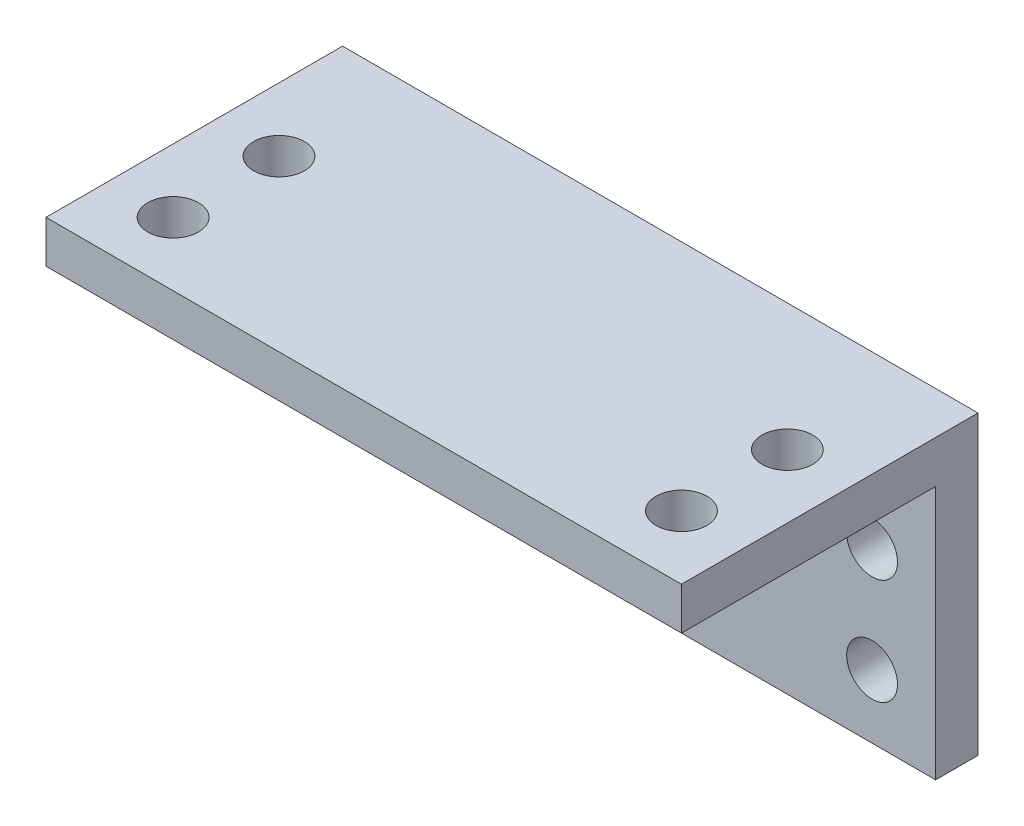
ISO-10303-21;
HEADER;
FILE_DESCRIPTION(('STEP AP214'),'2;1');
FILE_NAME('part.step','',(''),(''),'','','');
FILE_SCHEMA(('AUTOMOTIVE_DESIGN { 1 0 10303 214 1 1 1 1 }'));
ENDSEC;
DATA;
#1=APPLICATION_CONTEXT('core data for automotive mechanical design processes');
#2=APPLICATION_PROTOCOL_DEFINITION('international standard','automotive_design',2000,#1);
#3=PRODUCT_CONTEXT('',#1,'mechanical');
#4=PRODUCT('Part','Part','',(#3));
#5=PRODUCT_RELATED_PRODUCT_CATEGORY('part','',(#4));
#6=PRODUCT_DEFINITION_FORMATION('','',#4);
#7=PRODUCT_DEFINITION_CONTEXT('part definition',#1,'design');
#8=PRODUCT_DEFINITION('design','',#6,#7);
#9=PRODUCT_DEFINITION_SHAPE('','',#8);
#10=(LENGTH_UNIT() NAMED_UNIT(*) SI_UNIT(.MILLI.,.METRE.));
#11=(NAMED_UNIT(*) PLANE_ANGLE_UNIT() SI_UNIT($,.RADIAN.));
#12=(NAMED_UNIT(*) SI_UNIT($,.STERADIAN.) SOLID_ANGLE_UNIT());
#13=UNCERTAINTY_MEASURE_WITH_UNIT(LENGTH_MEASURE(1.E-05),#10,'distance_accuracy_value','');
#14=(GEOMETRIC_REPRESENTATION_CONTEXT(3) GLOBAL_UNCERTAINTY_ASSIGNED_CONTEXT((#13)) GLOBAL_UNIT_ASSIGNED_CONTEXT((#10,
#11,#12)) REPRESENTATION_CONTEXT('',''));
#15=CARTESIAN_POINT('',(0.,0.,0.));
#16=DIRECTION('',(0.,0.,1.));
#17=DIRECTION('',(1.,0.,0.));
#18=AXIS2_PLACEMENT_3D('',#15,#16,#17);
#19=CARTESIAN_POINT('',(38.1,-21.9756544502618,2.18094240837696));
#20=DIRECTION('',(0.,0.,-1.));
#21=DIRECTION('',(-1.,0.,0.));
#22=AXIS2_PLACEMENT_3D('',#19,#20,#21);
#23=PLANE('',#22);
#24=DIRECTION('',(0.,-1.,0.));
#25=VECTOR('',#24,1.);
#26=CARTESIAN_POINT('',(0.,-21.9756544502618,2.18094240837696));
#27=LINE('',#26,#25);
#28=CARTESIAN_POINT('',(0.,-19.4356544502618,2.18094240837696));
#29=VERTEX_POINT('',#28);
#30=CARTESIAN_POINT('',(0.,-21.9756544502618,2.18094240837696));
#31=VERTEX_POINT('',#30);
#32=EDGE_CURVE('E132',#29,#31,#27,.T.);
#33=ORIENTED_EDGE('',*,*,#32,.T.);
#34=DIRECTION('',(-1.,0.,0.));
#35=VECTOR('',#34,1.);
#36=CARTESIAN_POINT('',(38.1,-21.9756544502618,2.18094240837696));
#37=LINE('',#36,#35);
#38=CARTESIAN_POINT('',(38.1,-21.9756544502618,2.18094240837696));
#39=VERTEX_POINT('',#38);
#40=EDGE_CURVE('E11',#39,#31,#37,.T.);
#41=ORIENTED_EDGE('',*,*,#40,.F.);
#42=DIRECTION('',(0.,-1.,0.));
#43=VECTOR('',#42,1.);
#44=CARTESIAN_POINT('',(38.1,-21.9756544502618,2.18094240837696));
#45=LINE('',#44,#43);
#46=CARTESIAN_POINT('',(38.1,-19.4356544502618,2.18094240837696));
#47=VERTEX_POINT('',#46);
#48=EDGE_CURVE('E149',#47,#39,#45,.T.);
#49=ORIENTED_EDGE('',*,*,#48,.F.);
#50=DIRECTION('',(-1.,0.,0.));
#51=VECTOR('',#50,1.);
#52=CARTESIAN_POINT('',(38.1,-19.4356544502618,2.18094240837696));
#53=LINE('',#52,#51);
#54=EDGE_CURVE('E128',#47,#29,#53,.T.);
#55=ORIENTED_EDGE('',*,*,#54,.T.);
#56=EDGE_LOOP('',(#33,#41,#49,#55));
#57=FACE_BOUND('',#56,.T.);
#58=ADVANCED_FACE('F43',(#57),#23,.F.);
#59=CARTESIAN_POINT('',(38.1,-21.9756544502618,-13.059057591623));
#60=DIRECTION('',(0.,1.,0.));
#61=DIRECTION('',(0.,0.,1.));
#62=AXIS2_PLACEMENT_3D('',#59,#60,#61);
#63=PLANE('',#62);
#64=CARTESIAN_POINT('',(34.29,-21.9756544502618,-1.62905759162304));
#65=DIRECTION('',(0.,1.,0.));
#66=DIRECTION('',(0.,0.,1.));
#67=AXIS2_PLACEMENT_3D('',#64,#65,#66);
#68=CIRCLE('',#67,1.524);
#69=CARTESIAN_POINT('',(34.29,-21.9756544502618,-0.105057591623037));
#70=VERTEX_POINT('',#69);
#71=EDGE_CURVE('E354',#70,#70,#68,.T.);
#72=ORIENTED_EDGE('',*,*,#71,.T.);
#73=EDGE_LOOP('',(#72));
#74=FACE_BOUND('',#73,.T.);
#75=CARTESIAN_POINT('',(3.80999999999998,-21.9756544502618,-7.97905759162304));
#76=DIRECTION('',(0.,1.,0.));
#77=DIRECTION('',(0.,0.,1.));
#78=AXIS2_PLACEMENT_3D('',#75,#76,#77);
#79=CIRCLE('',#78,1.524);
#80=CARTESIAN_POINT('',(3.80999999999998,-21.9756544502618,-6.45505759162303));
#81=VERTEX_POINT('',#80);
#82=EDGE_CURVE('E357',#81,#81,#79,.T.);
#83=ORIENTED_EDGE('',*,*,#82,.T.);
#84=EDGE_LOOP('',(#83));
#85=FACE_BOUND('',#84,.T.);
#86=CARTESIAN_POINT('',(34.29,-21.9756544502618,-7.97905759162304));
#87=DIRECTION('',(0.,1.,0.));
#88=DIRECTION('',(0.,0.,1.));
#89=AXIS2_PLACEMENT_3D('',#86,#87,#88);
#90=CIRCLE('',#89,1.524);
#91=CARTESIAN_POINT('',(34.29,-21.9756544502618,-6.45505759162304));
#92=VERTEX_POINT('',#91);
#93=EDGE_CURVE('E365',#92,#92,#90,.T.);
#94=ORIENTED_EDGE('',*,*,#93,.T.);
#95=EDGE_LOOP('',(#94));
#96=FACE_BOUND('',#95,.T.);
#97=CARTESIAN_POINT('',(3.81,-21.9756544502618,-1.62905759162304));
#98=DIRECTION('',(0.,1.,0.));
#99=DIRECTION('',(0.,0.,1.));
#100=AXIS2_PLACEMENT_3D('',#97,#98,#99);
#101=CIRCLE('',#100,1.524);
#102=CARTESIAN_POINT('',(3.81,-21.9756544502618,-0.105057591623035));
#103=VERTEX_POINT('',#102);
#104=EDGE_CURVE('E420',#103,#103,#101,.T.);
#105=ORIENTED_EDGE('',*,*,#104,.T.);
#106=EDGE_LOOP('',(#105));
#107=FACE_BOUND('',#106,.T.);
#108=DIRECTION('',(0.,0.,-1.));
#109=VECTOR('',#108,1.);
#110=CARTESIAN_POINT('',(0.,-21.9756544502618,-13.059057591623));
#111=LINE('',#110,#109);
#112=CARTESIAN_POINT('',(0.,-21.9756544502618,-13.059057591623));
#113=VERTEX_POINT('',#112);
#114=EDGE_CURVE('E136',#31,#113,#111,.T.);
#115=ORIENTED_EDGE('',*,*,#114,.T.);
#116=DIRECTION('',(-1.,0.,0.));
#117=VECTOR('',#116,1.);
#118=CARTESIAN_POINT('',(38.1,-21.9756544502618,-13.059057591623));
#119=LINE('',#118,#117);
#120=CARTESIAN_POINT('',(38.1,-21.9756544502618,-13.059057591623));
#121=VERTEX_POINT('',#120);
#122=EDGE_CURVE('E52',#121,#113,#119,.T.);
#123=ORIENTED_EDGE('',*,*,#122,.F.);
#124=DIRECTION('',(0.,0.,-1.));
#125=VECTOR('',#124,1.);
#126=CARTESIAN_POINT('',(38.1,-21.9756544502618,-13.059057591623));
#127=LINE('',#126,#125);
#128=EDGE_CURVE('E97',#39,#121,#127,.T.);
#129=ORIENTED_EDGE('',*,*,#128,.F.);
#130=ORIENTED_EDGE('',*,*,#40,.T.);
#131=EDGE_LOOP('',(#115,#123,#129,#130));
#132=FACE_BOUND('',#131,.T.);
#133=ADVANCED_FACE('F181',(#74,#85,#96,#107,#132),#63,.F.);
#134=CARTESIAN_POINT('',(38.1,-37.2156544502618,-13.059057591623));
#135=DIRECTION('',(0.,0.,-1.));
#136=DIRECTION('',(-1.,0.,0.));
#137=AXIS2_PLACEMENT_3D('',#134,#135,#136);
#138=PLANE('',#137);
#139=CARTESIAN_POINT('',(3.81,-33.4056544502618,-13.059057591623));
#140=DIRECTION('',(0.,0.,-1.));
#141=DIRECTION('',(-1.,0.,0.));
#142=AXIS2_PLACEMENT_3D('',#139,#140,#141);
#143=CIRCLE('',#142,1.524);
#144=CARTESIAN_POINT('',(2.286,-33.4056544502618,-13.059057591623));
#145=VERTEX_POINT('',#144);
#146=EDGE_CURVE('E137',#145,#145,#143,.T.);
#147=ORIENTED_EDGE('',*,*,#146,.T.);
#148=EDGE_LOOP('',(#147));
#149=FACE_BOUND('',#148,.T.);
#150=CARTESIAN_POINT('',(34.29,-27.0556544502618,-13.059057591623));
#151=DIRECTION('',(0.,0.,-1.));
#152=DIRECTION('',(-1.,0.,0.));
#153=AXIS2_PLACEMENT_3D('',#150,#151,#152);
#154=CIRCLE('',#153,1.524);
#155=CARTESIAN_POINT('',(32.766,-27.0556544502618,-13.059057591623));
#156=VERTEX_POINT('',#155);
#157=EDGE_CURVE('E388',#156,#156,#154,.T.);
#158=ORIENTED_EDGE('',*,*,#157,.T.);
#159=EDGE_LOOP('',(#158));
#160=FACE_BOUND('',#159,.T.);
#161=CARTESIAN_POINT('',(3.81000000000003,-27.0556544502618,-13.059057591623));
#162=DIRECTION('',(0.,0.,-1.));
#163=DIRECTION('',(-1.,0.,0.));
#164=AXIS2_PLACEMENT_3D('',#161,#162,#163);
#165=CIRCLE('',#164,1.524);
#166=CARTESIAN_POINT('',(2.28600000000003,-27.0556544502618,-13.059057591623));
#167=VERTEX_POINT('',#166);
#168=EDGE_CURVE('E384',#167,#167,#165,.T.);
#169=ORIENTED_EDGE('',*,*,#168,.T.);
#170=EDGE_LOOP('',(#169));
#171=FACE_BOUND('',#170,.T.);
#172=CARTESIAN_POINT('',(34.29,-33.4056544502618,-13.059057591623));
#173=DIRECTION('',(0.,0.,-1.));
#174=DIRECTION('',(-1.,0.,0.));
#175=AXIS2_PLACEMENT_3D('',#172,#173,#174);
#176=CIRCLE('',#175,1.524);
#177=CARTESIAN_POINT('',(32.766,-33.4056544502618,-13.059057591623));
#178=VERTEX_POINT('',#177);
#179=EDGE_CURVE('E380',#178,#178,#176,.T.);
#180=ORIENTED_EDGE('',*,*,#179,.T.);
#181=EDGE_LOOP('',(#180));
#182=FACE_BOUND('',#181,.T.);
#183=DIRECTION('',(0.,-1.,0.));
#184=VECTOR('',#183,1.);
#185=CARTESIAN_POINT('',(0.,-37.2156544502618,-13.059057591623));
#186=LINE('',#185,#184);
#187=CARTESIAN_POINT('',(0.,-37.2156544502618,-13.059057591623));
#188=VERTEX_POINT('',#187);
#189=EDGE_CURVE('E140',#113,#188,#186,.T.);
#190=ORIENTED_EDGE('',*,*,#189,.T.);
#191=DIRECTION('',(-1.,0.,0.));
#192=VECTOR('',#191,1.);
#193=CARTESIAN_POINT('',(38.1,-37.2156544502618,-13.059057591623));
#194=LINE('',#193,#192);
#195=CARTESIAN_POINT('',(38.1,-37.2156544502618,-13.059057591623));
#196=VERTEX_POINT('',#195);
#197=EDGE_CURVE('E121',#196,#188,#194,.T.);
#198=ORIENTED_EDGE('',*,*,#197,.F.);
#199=DIRECTION('',(0.,-1.,0.));
#200=VECTOR('',#199,1.);
#201=CARTESIAN_POINT('',(38.1,-37.2156544502618,-13.059057591623));
#202=LINE('',#201,#200);
#203=EDGE_CURVE('E110',#121,#196,#202,.T.);
#204=ORIENTED_EDGE('',*,*,#203,.F.);
#205=ORIENTED_EDGE('',*,*,#122,.T.);
#206=EDGE_LOOP('',(#190,#198,#204,#205));
#207=FACE_BOUND('',#206,.T.);
#208=ADVANCED_FACE('F159',(#149,#160,#171,#182,#207),#138,.F.);
#209=CARTESIAN_POINT('',(38.1,-37.2156544502618,-15.599057591623));
#210=DIRECTION('',(0.,1.,0.));
#211=DIRECTION('',(0.,0.,1.));
#212=AXIS2_PLACEMENT_3D('',#209,#210,#211);
#213=PLANE('',#212);
#214=DIRECTION('',(0.,0.,-1.));
#215=VECTOR('',#214,1.);
#216=CARTESIAN_POINT('',(0.,-37.2156544502618,-15.599057591623));
#217=LINE('',#216,#215);
#218=CARTESIAN_POINT('',(0.,-37.2156544502618,-15.599057591623));
#219=VERTEX_POINT('',#218);
#220=EDGE_CURVE('E119',#188,#219,#217,.T.);
#221=ORIENTED_EDGE('',*,*,#220,.T.);
#222=DIRECTION('',(-1.,0.,0.));
#223=VECTOR('',#222,1.);
#224=CARTESIAN_POINT('',(38.1,-37.2156544502618,-15.599057591623));
#225=LINE('',#224,#223);
#226=CARTESIAN_POINT('',(38.1,-37.2156544502618,-15.599057591623));
#227=VERTEX_POINT('',#226);
#228=EDGE_CURVE('E116',#227,#219,#225,.T.);
#229=ORIENTED_EDGE('',*,*,#228,.F.);
#230=DIRECTION('',(0.,0.,-1.));
#231=VECTOR('',#230,1.);
#232=CARTESIAN_POINT('',(38.1,-37.2156544502618,-15.599057591623));
#233=LINE('',#232,#231);
#234=EDGE_CURVE('E104',#196,#227,#233,.T.);
#235=ORIENTED_EDGE('',*,*,#234,.F.);
#236=ORIENTED_EDGE('',*,*,#197,.T.);
#237=EDGE_LOOP('',(#221,#229,#235,#236));
#238=FACE_BOUND('',#237,.T.);
#239=ADVANCED_FACE('F117',(#238),#213,.F.);
#240=CARTESIAN_POINT('',(38.1,-19.4356544502618,-15.599057591623));
#241=DIRECTION('',(0.,0.,1.));
#242=DIRECTION('',(0.,-1.,0.));
#243=AXIS2_PLACEMENT_3D('',#240,#241,#242);
#244=PLANE('',#243);
#245=CARTESIAN_POINT('',(3.81,-33.4056544502618,-15.599057591623));
#246=DIRECTION('',(0.,0.,-1.));
#247=DIRECTION('',(0.,1.,0.));
#248=AXIS2_PLACEMENT_3D('',#245,#246,#247);
#249=CIRCLE('',#248,1.524);
#250=CARTESIAN_POINT('',(3.81,-31.8816544502618,-15.599057591623));
#251=VERTEX_POINT('',#250);
#252=EDGE_CURVE('E369',#251,#251,#249,.T.);
#253=ORIENTED_EDGE('',*,*,#252,.F.);
#254=EDGE_LOOP('',(#253));
#255=FACE_BOUND('',#254,.T.);
#256=CARTESIAN_POINT('',(34.29,-27.0556544502618,-15.599057591623));
#257=DIRECTION('',(0.,0.,-1.));
#258=DIRECTION('',(0.,1.,0.));
#259=AXIS2_PLACEMENT_3D('',#256,#257,#258);
#260=CIRCLE('',#259,1.524);
#261=CARTESIAN_POINT('',(34.29,-25.5316544502618,-15.599057591623));
#262=VERTEX_POINT('',#261);
#263=EDGE_CURVE('E362',#262,#262,#260,.T.);
#264=ORIENTED_EDGE('',*,*,#263,.F.);
#265=EDGE_LOOP('',(#264));
#266=FACE_BOUND('',#265,.T.);
#267=CARTESIAN_POINT('',(3.81000000000003,-27.0556544502618,-15.599057591623));
#268=DIRECTION('',(0.,0.,-1.));
#269=DIRECTION('',(0.,1.,0.));
#270=AXIS2_PLACEMENT_3D('',#267,#268,#269);
#271=CIRCLE('',#270,1.524);
#272=CARTESIAN_POINT('',(3.81000000000003,-25.5316544502618,-15.599057591623));
#273=VERTEX_POINT('',#272);
#274=EDGE_CURVE('E356',#273,#273,#271,.T.);
#275=ORIENTED_EDGE('',*,*,#274,.F.);
#276=EDGE_LOOP('',(#275));
#277=FACE_BOUND('',#276,.T.);
#278=CARTESIAN_POINT('',(34.29,-33.4056544502618,-15.599057591623));
#279=DIRECTION('',(0.,0.,-1.));
#280=DIRECTION('',(0.,1.,0.));
#281=AXIS2_PLACEMENT_3D('',#278,#279,#280);
#282=CIRCLE('',#281,1.524);
#283=CARTESIAN_POINT('',(34.29,-31.8816544502618,-15.599057591623));
#284=VERTEX_POINT('',#283);
#285=EDGE_CURVE('E373',#284,#284,#282,.T.);
#286=ORIENTED_EDGE('',*,*,#285,.F.);
#287=EDGE_LOOP('',(#286));
#288=FACE_BOUND('',#287,.T.);
#289=DIRECTION('',(0.,1.,0.));
#290=VECTOR('',#289,1.);
#291=CARTESIAN_POINT('',(0.,-19.4356544502618,-15.599057591623));
#292=LINE('',#291,#290);
#293=CARTESIAN_POINT('',(0.,-19.4356544502618,-15.599057591623));
#294=VERTEX_POINT('',#293);
#295=EDGE_CURVE('E83',#219,#294,#292,.T.);
#296=ORIENTED_EDGE('',*,*,#295,.T.);
#297=DIRECTION('',(-1.,0.,0.));
#298=VECTOR('',#297,1.);
#299=CARTESIAN_POINT('',(38.1,-19.4356544502618,-15.599057591623));
#300=LINE('',#299,#298);
#301=CARTESIAN_POINT('',(38.1,-19.4356544502618,-15.599057591623));
#302=VERTEX_POINT('',#301);
#303=EDGE_CURVE('E122',#302,#294,#300,.T.);
#304=ORIENTED_EDGE('',*,*,#303,.F.);
#305=DIRECTION('',(0.,1.,0.));
#306=VECTOR('',#305,1.);
#307=CARTESIAN_POINT('',(38.1,-19.4356544502618,-15.599057591623));
#308=LINE('',#307,#306);
#309=EDGE_CURVE('E108',#227,#302,#308,.T.);
#310=ORIENTED_EDGE('',*,*,#309,.F.);
#311=ORIENTED_EDGE('',*,*,#228,.T.);
#312=EDGE_LOOP('',(#296,#304,#310,#311));
#313=FACE_BOUND('',#312,.T.);
#314=ADVANCED_FACE('F124',(#255,#266,#277,#288,#313),#244,.F.);
#315=CARTESIAN_POINT('',(38.1,-19.4356544502618,2.18094240837696));
#316=DIRECTION('',(0.,-1.,0.));
#317=DIRECTION('',(0.,0.,-1.));
#318=AXIS2_PLACEMENT_3D('',#315,#316,#317);
#319=PLANE('',#318);
#320=CARTESIAN_POINT('',(34.29,-19.4356544502618,-1.62905759162304));
#321=DIRECTION('',(0.,1.,0.));
#322=DIRECTION('',(0.,0.,1.));
#323=AXIS2_PLACEMENT_3D('',#320,#321,#322);
#324=CIRCLE('',#323,1.524);
#325=CARTESIAN_POINT('',(34.29,-19.4356544502618,-0.105057591623037));
#326=VERTEX_POINT('',#325);
#327=EDGE_CURVE('E352',#326,#326,#324,.T.);
#328=ORIENTED_EDGE('',*,*,#327,.F.);
#329=EDGE_LOOP('',(#328));
#330=FACE_BOUND('',#329,.T.);
#331=CARTESIAN_POINT('',(3.80999999999998,-19.4356544502618,-7.97905759162304));
#332=DIRECTION('',(0.,1.,0.));
#333=DIRECTION('',(0.,0.,1.));
#334=AXIS2_PLACEMENT_3D('',#331,#332,#333);
#335=CIRCLE('',#334,1.524);
#336=CARTESIAN_POINT('',(3.80999999999998,-19.4356544502618,-6.45505759162303));
#337=VERTEX_POINT('',#336);
#338=EDGE_CURVE('E428',#337,#337,#335,.T.);
#339=ORIENTED_EDGE('',*,*,#338,.F.);
#340=EDGE_LOOP('',(#339));
#341=FACE_BOUND('',#340,.T.);
#342=CARTESIAN_POINT('',(34.29,-19.4356544502618,-7.97905759162304));
#343=DIRECTION('',(0.,1.,0.));
#344=DIRECTION('',(0.,0.,1.));
#345=AXIS2_PLACEMENT_3D('',#342,#343,#344);
#346=CIRCLE('',#345,1.524);
#347=CARTESIAN_POINT('',(34.29,-19.4356544502618,-6.45505759162304));
#348=VERTEX_POINT('',#347);
#349=EDGE_CURVE('E432',#348,#348,#346,.T.);
#350=ORIENTED_EDGE('',*,*,#349,.F.);
#351=EDGE_LOOP('',(#350));
#352=FACE_BOUND('',#351,.T.);
#353=CARTESIAN_POINT('',(3.81,-19.4356544502618,-1.62905759162304));
#354=DIRECTION('',(0.,1.,0.));
#355=DIRECTION('',(0.,0.,1.));
#356=AXIS2_PLACEMENT_3D('',#353,#354,#355);
#357=CIRCLE('',#356,1.524);
#358=CARTESIAN_POINT('',(3.81,-19.4356544502618,-0.105057591623035));
#359=VERTEX_POINT('',#358);
#360=EDGE_CURVE('E424',#359,#359,#357,.T.);
#361=ORIENTED_EDGE('',*,*,#360,.F.);
#362=EDGE_LOOP('',(#361));
#363=FACE_BOUND('',#362,.T.);
#364=DIRECTION('',(0.,0.,1.));
#365=VECTOR('',#364,1.);
#366=CARTESIAN_POINT('',(0.,-19.4356544502618,2.18094240837696));
#367=LINE('',#366,#365);
#368=EDGE_CURVE('E89',#294,#29,#367,.T.);
#369=ORIENTED_EDGE('',*,*,#368,.T.);
#370=ORIENTED_EDGE('',*,*,#54,.F.);
#371=DIRECTION('',(0.,0.,1.));
#372=VECTOR('',#371,1.);
#373=CARTESIAN_POINT('',(38.1,-19.4356544502618,2.18094240837696));
#374=LINE('',#373,#372);
#375=EDGE_CURVE('E60',#302,#47,#374,.T.);
#376=ORIENTED_EDGE('',*,*,#375,.F.);
#377=ORIENTED_EDGE('',*,*,#303,.T.);
#378=EDGE_LOOP('',(#369,#370,#376,#377));
#379=FACE_BOUND('',#378,.T.);
#380=ADVANCED_FACE('F166',(#330,#341,#352,#363,#379),#319,.F.);
#381=CARTESIAN_POINT('',(38.1,0.,0.));
#382=DIRECTION('',(-1.,0.,0.));
#383=DIRECTION('',(0.,0.,1.));
#384=AXIS2_PLACEMENT_3D('',#381,#382,#383);
#385=PLANE('',#384);
#386=ORIENTED_EDGE('',*,*,#48,.T.);
#387=ORIENTED_EDGE('',*,*,#128,.T.);
#388=ORIENTED_EDGE('',*,*,#203,.T.);
#389=ORIENTED_EDGE('',*,*,#234,.T.);
#390=ORIENTED_EDGE('',*,*,#309,.T.);
#391=ORIENTED_EDGE('',*,*,#375,.T.);
#392=EDGE_LOOP('',(#386,#387,#388,#389,#390,#391));
#393=FACE_BOUND('',#392,.T.);
#394=ADVANCED_FACE('F106',(#393),#385,.F.);
#395=CARTESIAN_POINT('',(0.,0.,0.));
#396=DIRECTION('',(-1.,0.,0.));
#397=DIRECTION('',(0.,0.,1.));
#398=AXIS2_PLACEMENT_3D('',#395,#396,#397);
#399=PLANE('',#398);
#400=ORIENTED_EDGE('',*,*,#32,.F.);
#401=ORIENTED_EDGE('',*,*,#368,.F.);
#402=ORIENTED_EDGE('',*,*,#295,.F.);
#403=ORIENTED_EDGE('',*,*,#220,.F.);
#404=ORIENTED_EDGE('',*,*,#189,.F.);
#405=ORIENTED_EDGE('',*,*,#114,.F.);
#406=EDGE_LOOP('',(#400,#401,#402,#403,#404,#405));
#407=FACE_BOUND('',#406,.T.);
#408=ADVANCED_FACE('F162',(#407),#399,.T.);
#409=CARTESIAN_POINT('',(34.29,-33.4056544502618,2.18094240837697));
#410=DIRECTION('',(0.,0.,-1.));
#411=DIRECTION('',(0.,1.,0.));
#412=AXIS2_PLACEMENT_3D('',#409,#410,#411);
#413=CYLINDRICAL_SURFACE('',#412,1.524);
#414=ORIENTED_EDGE('',*,*,#285,.T.);
#415=EDGE_LOOP('',(#414));
#416=FACE_BOUND('',#415,.T.);
#417=ORIENTED_EDGE('',*,*,#179,.F.);
#418=EDGE_LOOP('',(#417));
#419=FACE_BOUND('',#418,.T.);
#420=ADVANCED_FACE('F214',(#416,#419),#413,.F.);
#421=CARTESIAN_POINT('',(3.81000000000003,-27.0556544502618,2.18094240837697));
#422=DIRECTION('',(0.,0.,-1.));
#423=DIRECTION('',(0.,1.,0.));
#424=AXIS2_PLACEMENT_3D('',#421,#422,#423);
#425=CYLINDRICAL_SURFACE('',#424,1.524);
#426=ORIENTED_EDGE('',*,*,#274,.T.);
#427=EDGE_LOOP('',(#426));
#428=FACE_BOUND('',#427,.T.);
#429=ORIENTED_EDGE('',*,*,#168,.F.);
#430=EDGE_LOOP('',(#429));
#431=FACE_BOUND('',#430,.T.);
#432=ADVANCED_FACE('F219',(#428,#431),#425,.F.);
#433=CARTESIAN_POINT('',(34.29,-27.0556544502618,2.18094240837697));
#434=DIRECTION('',(0.,0.,-1.));
#435=DIRECTION('',(0.,1.,0.));
#436=AXIS2_PLACEMENT_3D('',#433,#434,#435);
#437=CYLINDRICAL_SURFACE('',#436,1.524);
#438=ORIENTED_EDGE('',*,*,#263,.T.);
#439=EDGE_LOOP('',(#438));
#440=FACE_BOUND('',#439,.T.);
#441=ORIENTED_EDGE('',*,*,#157,.F.);
#442=EDGE_LOOP('',(#441));
#443=FACE_BOUND('',#442,.T.);
#444=ADVANCED_FACE('F232',(#440,#443),#437,.F.);
#445=CARTESIAN_POINT('',(3.81,-33.4056544502618,2.18094240837697));
#446=DIRECTION('',(0.,0.,-1.));
#447=DIRECTION('',(0.,1.,0.));
#448=AXIS2_PLACEMENT_3D('',#445,#446,#447);
#449=CYLINDRICAL_SURFACE('',#448,1.524);
#450=ORIENTED_EDGE('',*,*,#252,.T.);
#451=EDGE_LOOP('',(#450));
#452=FACE_BOUND('',#451,.T.);
#453=ORIENTED_EDGE('',*,*,#146,.F.);
#454=EDGE_LOOP('',(#453));
#455=FACE_BOUND('',#454,.T.);
#456=ADVANCED_FACE('F243',(#452,#455),#449,.F.);
#457=CARTESIAN_POINT('',(3.81,-37.2156544502618,-1.62905759162304));
#458=DIRECTION('',(0.,1.,0.));
#459=DIRECTION('',(0.,0.,1.));
#460=AXIS2_PLACEMENT_3D('',#457,#458,#459);
#461=CYLINDRICAL_SURFACE('',#460,1.524);
#462=CARTESIAN_POINT('',(3.81,-19.4356544502618,-0.105057591623035));
#463=CARTESIAN_POINT('',(3.81,-19.4621127835951,-0.105057591623035));
#464=CARTESIAN_POINT('',(3.81,-19.4885711169284,-0.105057591623035));
#465=CARTESIAN_POINT('',(3.81,-19.5414877835951,-0.105057591623035));
#466=CARTESIAN_POINT('',(3.81,-19.5679461169284,-0.105057591623035));
#467=CARTESIAN_POINT('',(3.81,-19.6208627835951,-0.105057591623035));
#468=CARTESIAN_POINT('',(3.81,-19.6473211169284,-0.105057591623035));
#469=CARTESIAN_POINT('',(3.81,-19.7002377835951,-0.105057591623035));
#470=CARTESIAN_POINT('',(3.81,-19.7266961169284,-0.105057591623035));
#471=CARTESIAN_POINT('',(3.81,-19.7796127835951,-0.105057591623035));
#472=CARTESIAN_POINT('',(3.81,-19.8060711169284,-0.105057591623035));
#473=CARTESIAN_POINT('',(3.81,-19.8589877835951,-0.105057591623035));
#474=CARTESIAN_POINT('',(3.81,-19.8854461169284,-0.105057591623035));
#475=CARTESIAN_POINT('',(3.81,-19.9383627835951,-0.105057591623035));
#476=CARTESIAN_POINT('',(3.81,-19.9648211169284,-0.105057591623035));
#477=CARTESIAN_POINT('',(3.81,-20.0177377835951,-0.105057591623035));
#478=CARTESIAN_POINT('',(3.81,-20.0441961169284,-0.105057591623035));
#479=CARTESIAN_POINT('',(3.81,-20.0971127835951,-0.105057591623035));
#480=CARTESIAN_POINT('',(3.81,-20.1235711169284,-0.105057591623035));
#481=CARTESIAN_POINT('',(3.81,-20.1764877835951,-0.105057591623035));
#482=CARTESIAN_POINT('',(3.81,-20.2029461169284,-0.105057591623035));
#483=CARTESIAN_POINT('',(3.81,-20.2558627835951,-0.105057591623035));
#484=CARTESIAN_POINT('',(3.81,-20.2823211169284,-0.105057591623035));
#485=CARTESIAN_POINT('',(3.81,-20.3352377835951,-0.105057591623035));
#486=CARTESIAN_POINT('',(3.81,-20.3616961169284,-0.105057591623035));
#487=CARTESIAN_POINT('',(3.81,-20.4146127835951,-0.105057591623035));
#488=CARTESIAN_POINT('',(3.81,-20.4410711169284,-0.105057591623035));
#489=CARTESIAN_POINT('',(3.81,-20.4939877835951,-0.105057591623035));
#490=CARTESIAN_POINT('',(3.81,-20.5204461169284,-0.105057591623035));
#491=CARTESIAN_POINT('',(3.81,-20.5733627835951,-0.105057591623035));
#492=CARTESIAN_POINT('',(3.81,-20.5998211169284,-0.105057591623035));
#493=CARTESIAN_POINT('',(3.81,-20.6527377835951,-0.105057591623035));
#494=CARTESIAN_POINT('',(3.81,-20.6791961169284,-0.105057591623035));
#495=CARTESIAN_POINT('',(3.81,-20.7321127835951,-0.105057591623035));
#496=CARTESIAN_POINT('',(3.81,-20.7585711169285,-0.105057591623035));
#497=CARTESIAN_POINT('',(3.81,-20.8114877835951,-0.105057591623035));
#498=CARTESIAN_POINT('',(3.81,-20.8379461169284,-0.105057591623035));
#499=CARTESIAN_POINT('',(3.81,-20.8908627835951,-0.105057591623035));
#500=CARTESIAN_POINT('',(3.81,-20.9173211169284,-0.105057591623035));
#501=CARTESIAN_POINT('',(3.81,-20.9702377835951,-0.105057591623035));
#502=CARTESIAN_POINT('',(3.81,-20.9966961169284,-0.105057591623035));
#503=CARTESIAN_POINT('',(3.81,-21.0496127835951,-0.105057591623035));
#504=CARTESIAN_POINT('',(3.81,-21.0760711169284,-0.105057591623035));
#505=CARTESIAN_POINT('',(3.81,-21.1289877835951,-0.105057591623035));
#506=CARTESIAN_POINT('',(3.81,-21.1554461169284,-0.105057591623035));
#507=CARTESIAN_POINT('',(3.81,-21.2083627835951,-0.105057591623035));
#508=CARTESIAN_POINT('',(3.81,-21.2348211169285,-0.105057591623035));
#509=CARTESIAN_POINT('',(3.81,-21.2877377835951,-0.105057591623035));
#510=CARTESIAN_POINT('',(3.81,-21.3141961169284,-0.105057591623035));
#511=CARTESIAN_POINT('',(3.81,-21.3671127835951,-0.105057591623035));
#512=CARTESIAN_POINT('',(3.81,-21.3935711169284,-0.105057591623035));
#513=CARTESIAN_POINT('',(3.81,-21.4464877835951,-0.105057591623035));
#514=CARTESIAN_POINT('',(3.81,-21.4729461169284,-0.105057591623035));
#515=CARTESIAN_POINT('',(3.81,-21.5258627835951,-0.105057591623035));
#516=CARTESIAN_POINT('',(3.81,-21.5523211169285,-0.105057591623035));
#517=CARTESIAN_POINT('',(3.81,-21.6052377835951,-0.105057591623035));
#518=CARTESIAN_POINT('',(3.81,-21.6316961169284,-0.105057591623035));
#519=CARTESIAN_POINT('',(3.81,-21.6846127835951,-0.105057591623035));
#520=CARTESIAN_POINT('',(3.81,-21.7110711169284,-0.105057591623035));
#521=CARTESIAN_POINT('',(3.81,-21.7639877835951,-0.105057591623035));
#522=CARTESIAN_POINT('',(3.81,-21.7904461169285,-0.105057591623035));
#523=CARTESIAN_POINT('',(3.81,-21.8433627835951,-0.105057591623035));
#524=CARTESIAN_POINT('',(3.81,-21.8698211169284,-0.105057591623035));
#525=CARTESIAN_POINT('',(3.81,-21.9227377835951,-0.105057591623035));
#526=CARTESIAN_POINT('',(3.81,-21.9491961169285,-0.105057591623035));
#527=CARTESIAN_POINT('',(3.81,-21.9756544502618,-0.105057591623035));
#528=B_SPLINE_CURVE_WITH_KNOTS('',3,(#462,#463,#464,#465,#466,#467,#468,#469,#470,#471,#472,
#473,#474,#475,#476,#477,#478,#479,#480,#481,#482,#483,#484,#485,#486,#487,#488,#489,#490,#491,
#492,#493,#494,#495,#496,#497,#498,#499,#500,#501,#502,#503,#504,#505,#506,#507,#508,#509,#510,
#511,#512,#513,#514,#515,#516,#517,#518,#519,#520,#521,#522,#523,#524,#525,#526,#527),
.UNSPECIFIED.,.F.,.F.,(4,2,2,2,2,2,2,2,2,2,2,2,2,2,2,2,2,2,2,2,2,2,2,2,2,2,2,2,2,2,2,2,4),(0.,
0.0793749999999996,0.158749999999999,0.238124999999999,0.317500000000002,0.396875000000001,
0.476250000000001,0.555625000000001,0.635,0.714375,0.793750000000003,0.873125000000002,
0.952500000000002,1.031875,1.11125,1.190625,1.27,1.349375,1.42875,1.508125,1.5875,1.666875,
1.74625,1.825625,1.905,1.984375,2.06375,2.143125,2.2225,2.301875,2.38125,2.460625,2.54),.UNSPECIFIED.);
#529=EDGE_CURVE('BSEAM253',#359,#103,#528,.T.);
#530=ORIENTED_EDGE('',*,*,#360,.T.);
#531=ORIENTED_EDGE('',*,*,#104,.F.);
#532=ORIENTED_EDGE('',*,*,#529,.T.);
#533=ORIENTED_EDGE('',*,*,#529,.F.);
#534=EDGE_LOOP('',(#530,#532,#531,#533));
#535=FACE_BOUND('',#534,.T.);
#536=ADVANCED_FACE('F253',(#535),#461,.F.);
#537=CARTESIAN_POINT('',(34.29,-37.2156544502618,-7.97905759162304));
#538=DIRECTION('',(0.,1.,0.));
#539=DIRECTION('',(0.,0.,1.));
#540=AXIS2_PLACEMENT_3D('',#537,#538,#539);
#541=CYLINDRICAL_SURFACE('',#540,1.524);
#542=CARTESIAN_POINT('',(34.29,-19.4356544502618,-6.45505759162304));
#543=CARTESIAN_POINT('',(34.29,-19.4621127835951,-6.45505759162304));
#544=CARTESIAN_POINT('',(34.29,-19.4885711169284,-6.45505759162304));
#545=CARTESIAN_POINT('',(34.29,-19.5414877835951,-6.45505759162304));
#546=CARTESIAN_POINT('',(34.29,-19.5679461169284,-6.45505759162304));
#547=CARTESIAN_POINT('',(34.29,-19.6208627835951,-6.45505759162304));
#548=CARTESIAN_POINT('',(34.29,-19.6473211169284,-6.45505759162304));
#549=CARTESIAN_POINT('',(34.29,-19.7002377835951,-6.45505759162304));
#550=CARTESIAN_POINT('',(34.29,-19.7266961169284,-6.45505759162304));
#551=CARTESIAN_POINT('',(34.29,-19.7796127835951,-6.45505759162304));
#552=CARTESIAN_POINT('',(34.29,-19.8060711169284,-6.45505759162304));
#553=CARTESIAN_POINT('',(34.29,-19.8589877835951,-6.45505759162304));
#554=CARTESIAN_POINT('',(34.29,-19.8854461169284,-6.45505759162304));
#555=CARTESIAN_POINT('',(34.29,-19.9383627835951,-6.45505759162304));
#556=CARTESIAN_POINT('',(34.29,-19.9648211169284,-6.45505759162304));
#557=CARTESIAN_POINT('',(34.29,-20.0177377835951,-6.45505759162304));
#558=CARTESIAN_POINT('',(34.29,-20.0441961169284,-6.45505759162304));
#559=CARTESIAN_POINT('',(34.29,-20.0971127835951,-6.45505759162304));
#560=CARTESIAN_POINT('',(34.29,-20.1235711169284,-6.45505759162304));
#561=CARTESIAN_POINT('',(34.29,-20.1764877835951,-6.45505759162304));
#562=CARTESIAN_POINT('',(34.29,-20.2029461169284,-6.45505759162304));
#563=CARTESIAN_POINT('',(34.29,-20.2558627835951,-6.45505759162304));
#564=CARTESIAN_POINT('',(34.29,-20.2823211169284,-6.45505759162304));
#565=CARTESIAN_POINT('',(34.29,-20.3352377835951,-6.45505759162304));
#566=CARTESIAN_POINT('',(34.29,-20.3616961169284,-6.45505759162304));
#567=CARTESIAN_POINT('',(34.29,-20.4146127835951,-6.45505759162304));
#568=CARTESIAN_POINT('',(34.29,-20.4410711169284,-6.45505759162304));
#569=CARTESIAN_POINT('',(34.29,-20.4939877835951,-6.45505759162304));
#570=CARTESIAN_POINT('',(34.29,-20.5204461169284,-6.45505759162304));
#571=CARTESIAN_POINT('',(34.29,-20.5733627835951,-6.45505759162304));
#572=CARTESIAN_POINT('',(34.29,-20.5998211169284,-6.45505759162304));
#573=CARTESIAN_POINT('',(34.29,-20.6527377835951,-6.45505759162304));
#574=CARTESIAN_POINT('',(34.29,-20.6791961169284,-6.45505759162304));
#575=CARTESIAN_POINT('',(34.29,-20.7321127835951,-6.45505759162304));
#576=CARTESIAN_POINT('',(34.29,-20.7585711169285,-6.45505759162304));
#577=CARTESIAN_POINT('',(34.29,-20.8114877835951,-6.45505759162304));
#578=CARTESIAN_POINT('',(34.29,-20.8379461169284,-6.45505759162304));
#579=CARTESIAN_POINT('',(34.29,-20.8908627835951,-6.45505759162304));
#580=CARTESIAN_POINT('',(34.29,-20.9173211169284,-6.45505759162304));
#581=CARTESIAN_POINT('',(34.29,-20.9702377835951,-6.45505759162304));
#582=CARTESIAN_POINT('',(34.29,-20.9966961169284,-6.45505759162304));
#583=CARTESIAN_POINT('',(34.29,-21.0496127835951,-6.45505759162304));
#584=CARTESIAN_POINT('',(34.29,-21.0760711169284,-6.45505759162304));
#585=CARTESIAN_POINT('',(34.29,-21.1289877835951,-6.45505759162304));
#586=CARTESIAN_POINT('',(34.29,-21.1554461169284,-6.45505759162304));
#587=CARTESIAN_POINT('',(34.29,-21.2083627835951,-6.45505759162304));
#588=CARTESIAN_POINT('',(34.29,-21.2348211169285,-6.45505759162304));
#589=CARTESIAN_POINT('',(34.29,-21.2877377835951,-6.45505759162304));
#590=CARTESIAN_POINT('',(34.29,-21.3141961169284,-6.45505759162304));
#591=CARTESIAN_POINT('',(34.29,-21.3671127835951,-6.45505759162304));
#592=CARTESIAN_POINT('',(34.29,-21.3935711169284,-6.45505759162304));
#593=CARTESIAN_POINT('',(34.29,-21.4464877835951,-6.45505759162304));
#594=CARTESIAN_POINT('',(34.29,-21.4729461169284,-6.45505759162304));
#595=CARTESIAN_POINT('',(34.29,-21.5258627835951,-6.45505759162304));
#596=CARTESIAN_POINT('',(34.29,-21.5523211169285,-6.45505759162304));
#597=CARTESIAN_POINT('',(34.29,-21.6052377835951,-6.45505759162304));
#598=CARTESIAN_POINT('',(34.29,-21.6316961169284,-6.45505759162304));
#599=CARTESIAN_POINT('',(34.29,-21.6846127835951,-6.45505759162304));
#600=CARTESIAN_POINT('',(34.29,-21.7110711169284,-6.45505759162304));
#601=CARTESIAN_POINT('',(34.29,-21.7639877835951,-6.45505759162304));
#602=CARTESIAN_POINT('',(34.29,-21.7904461169285,-6.45505759162304));
#603=CARTESIAN_POINT('',(34.29,-21.8433627835951,-6.45505759162304));
#604=CARTESIAN_POINT('',(34.29,-21.8698211169284,-6.45505759162304));
#605=CARTESIAN_POINT('',(34.29,-21.9227377835951,-6.45505759162304));
#606=CARTESIAN_POINT('',(34.29,-21.9491961169285,-6.45505759162304));
#607=CARTESIAN_POINT('',(34.29,-21.9756544502618,-6.45505759162304));
#608=B_SPLINE_CURVE_WITH_KNOTS('',3,(#542,#543,#544,#545,#546,#547,#548,#549,#550,#551,#552,
#553,#554,#555,#556,#557,#558,#559,#560,#561,#562,#563,#564,#565,#566,#567,#568,#569,#570,#571,
#572,#573,#574,#575,#576,#577,#578,#579,#580,#581,#582,#583,#584,#585,#586,#587,#588,#589,#590,
#591,#592,#593,#594,#595,#596,#597,#598,#599,#600,#601,#602,#603,#604,#605,#606,#607),
.UNSPECIFIED.,.F.,.F.,(4,2,2,2,2,2,2,2,2,2,2,2,2,2,2,2,2,2,2,2,2,2,2,2,2,2,2,2,2,2,2,2,4),(0.,
0.0793749999999996,0.158749999999999,0.238124999999999,0.317500000000002,0.396875000000001,
0.476250000000001,0.555625000000001,0.635,0.714375,0.793750000000003,0.873125000000002,
0.952500000000002,1.031875,1.11125,1.190625,1.27,1.349375,1.42875,1.508125,1.5875,1.666875,
1.74625,1.825625,1.905,1.984375,2.06375,2.143125,2.2225,2.301875,2.38125,2.460625,2.54),.UNSPECIFIED.);
#609=EDGE_CURVE('BSEAM276',#348,#92,#608,.T.);
#610=ORIENTED_EDGE('',*,*,#349,.T.);
#611=ORIENTED_EDGE('',*,*,#93,.F.);
#612=ORIENTED_EDGE('',*,*,#609,.T.);
#613=ORIENTED_EDGE('',*,*,#609,.F.);
#614=EDGE_LOOP('',(#610,#612,#611,#613));
#615=FACE_BOUND('',#614,.T.);
#616=ADVANCED_FACE('F276',(#615),#541,.F.);
#617=CARTESIAN_POINT('',(3.80999999999998,-37.2156544502618,-7.97905759162304));
#618=DIRECTION('',(0.,1.,0.));
#619=DIRECTION('',(0.,0.,1.));
#620=AXIS2_PLACEMENT_3D('',#617,#618,#619);
#621=CYLINDRICAL_SURFACE('',#620,1.524);
#622=CARTESIAN_POINT('',(3.80999999999998,-19.4356544502618,-6.45505759162303));
#623=CARTESIAN_POINT('',(3.80999999999998,-19.4621127835951,-6.45505759162303));
#624=CARTESIAN_POINT('',(3.80999999999998,-19.4885711169284,-6.45505759162303));
#625=CARTESIAN_POINT('',(3.80999999999998,-19.5414877835951,-6.45505759162303));
#626=CARTESIAN_POINT('',(3.80999999999998,-19.5679461169284,-6.45505759162303));
#627=CARTESIAN_POINT('',(3.80999999999998,-19.6208627835951,-6.45505759162303));
#628=CARTESIAN_POINT('',(3.80999999999998,-19.6473211169284,-6.45505759162303));
#629=CARTESIAN_POINT('',(3.80999999999998,-19.7002377835951,-6.45505759162303));
#630=CARTESIAN_POINT('',(3.80999999999998,-19.7266961169284,-6.45505759162303));
#631=CARTESIAN_POINT('',(3.80999999999998,-19.7796127835951,-6.45505759162303));
#632=CARTESIAN_POINT('',(3.80999999999998,-19.8060711169284,-6.45505759162303));
#633=CARTESIAN_POINT('',(3.80999999999998,-19.8589877835951,-6.45505759162303));
#634=CARTESIAN_POINT('',(3.80999999999998,-19.8854461169284,-6.45505759162303));
#635=CARTESIAN_POINT('',(3.80999999999998,-19.9383627835951,-6.45505759162303));
#636=CARTESIAN_POINT('',(3.80999999999998,-19.9648211169284,-6.45505759162303));
#637=CARTESIAN_POINT('',(3.80999999999998,-20.0177377835951,-6.45505759162303));
#638=CARTESIAN_POINT('',(3.80999999999998,-20.0441961169284,-6.45505759162303));
#639=CARTESIAN_POINT('',(3.80999999999998,-20.0971127835951,-6.45505759162303));
#640=CARTESIAN_POINT('',(3.80999999999998,-20.1235711169284,-6.45505759162303));
#641=CARTESIAN_POINT('',(3.80999999999998,-20.1764877835951,-6.45505759162303));
#642=CARTESIAN_POINT('',(3.80999999999998,-20.2029461169284,-6.45505759162303));
#643=CARTESIAN_POINT('',(3.80999999999998,-20.2558627835951,-6.45505759162303));
#644=CARTESIAN_POINT('',(3.80999999999998,-20.2823211169284,-6.45505759162303));
#645=CARTESIAN_POINT('',(3.80999999999998,-20.3352377835951,-6.45505759162303));
#646=CARTESIAN_POINT('',(3.80999999999998,-20.3616961169284,-6.45505759162303));
#647=CARTESIAN_POINT('',(3.80999999999998,-20.4146127835951,-6.45505759162303));
#648=CARTESIAN_POINT('',(3.80999999999998,-20.4410711169284,-6.45505759162303));
#649=CARTESIAN_POINT('',(3.80999999999998,-20.4939877835951,-6.45505759162303));
#650=CARTESIAN_POINT('',(3.80999999999998,-20.5204461169284,-6.45505759162303));
#651=CARTESIAN_POINT('',(3.80999999999998,-20.5733627835951,-6.45505759162303));
#652=CARTESIAN_POINT('',(3.80999999999998,-20.5998211169284,-6.45505759162303));
#653=CARTESIAN_POINT('',(3.80999999999998,-20.6527377835951,-6.45505759162303));
#654=CARTESIAN_POINT('',(3.80999999999998,-20.6791961169284,-6.45505759162303));
#655=CARTESIAN_POINT('',(3.80999999999998,-20.7321127835951,-6.45505759162303));
#656=CARTESIAN_POINT('',(3.80999999999998,-20.7585711169285,-6.45505759162303));
#657=CARTESIAN_POINT('',(3.80999999999998,-20.8114877835951,-6.45505759162303));
#658=CARTESIAN_POINT('',(3.80999999999998,-20.8379461169284,-6.45505759162303));
#659=CARTESIAN_POINT('',(3.80999999999998,-20.8908627835951,-6.45505759162303));
#660=CARTESIAN_POINT('',(3.80999999999998,-20.9173211169284,-6.45505759162303));
#661=CARTESIAN_POINT('',(3.80999999999998,-20.9702377835951,-6.45505759162303));
#662=CARTESIAN_POINT('',(3.80999999999998,-20.9966961169284,-6.45505759162303));
#663=CARTESIAN_POINT('',(3.80999999999998,-21.0496127835951,-6.45505759162303));
#664=CARTESIAN_POINT('',(3.80999999999998,-21.0760711169284,-6.45505759162303));
#665=CARTESIAN_POINT('',(3.80999999999998,-21.1289877835951,-6.45505759162303));
#666=CARTESIAN_POINT('',(3.80999999999998,-21.1554461169284,-6.45505759162303));
#667=CARTESIAN_POINT('',(3.80999999999998,-21.2083627835951,-6.45505759162303));
#668=CARTESIAN_POINT('',(3.80999999999998,-21.2348211169285,-6.45505759162303));
#669=CARTESIAN_POINT('',(3.80999999999998,-21.2877377835951,-6.45505759162303));
#670=CARTESIAN_POINT('',(3.80999999999998,-21.3141961169284,-6.45505759162303));
#671=CARTESIAN_POINT('',(3.80999999999998,-21.3671127835951,-6.45505759162303));
#672=CARTESIAN_POINT('',(3.80999999999998,-21.3935711169284,-6.45505759162303));
#673=CARTESIAN_POINT('',(3.80999999999998,-21.4464877835951,-6.45505759162303));
#674=CARTESIAN_POINT('',(3.80999999999998,-21.4729461169284,-6.45505759162303));
#675=CARTESIAN_POINT('',(3.80999999999998,-21.5258627835951,-6.45505759162303));
#676=CARTESIAN_POINT('',(3.80999999999998,-21.5523211169285,-6.45505759162303));
#677=CARTESIAN_POINT('',(3.80999999999998,-21.6052377835951,-6.45505759162303));
#678=CARTESIAN_POINT('',(3.80999999999998,-21.6316961169284,-6.45505759162303));
#679=CARTESIAN_POINT('',(3.80999999999998,-21.6846127835951,-6.45505759162303));
#680=CARTESIAN_POINT('',(3.80999999999998,-21.7110711169284,-6.45505759162303));
#681=CARTESIAN_POINT('',(3.80999999999998,-21.7639877835951,-6.45505759162303));
#682=CARTESIAN_POINT('',(3.80999999999998,-21.7904461169285,-6.45505759162303));
#683=CARTESIAN_POINT('',(3.80999999999998,-21.8433627835951,-6.45505759162303));
#684=CARTESIAN_POINT('',(3.80999999999998,-21.8698211169284,-6.45505759162303));
#685=CARTESIAN_POINT('',(3.80999999999998,-21.9227377835951,-6.45505759162303));
#686=CARTESIAN_POINT('',(3.80999999999998,-21.9491961169285,-6.45505759162303));
#687=CARTESIAN_POINT('',(3.80999999999998,-21.9756544502618,-6.45505759162303));
#688=B_SPLINE_CURVE_WITH_KNOTS('',3,(#622,#623,#624,#625,#626,#627,#628,#629,#630,#631,#632,
#633,#634,#635,#636,#637,#638,#639,#640,#641,#642,#643,#644,#645,#646,#647,#648,#649,#650,#651,
#652,#653,#654,#655,#656,#657,#658,#659,#660,#661,#662,#663,#664,#665,#666,#667,#668,#669,#670,
#671,#672,#673,#674,#675,#676,#677,#678,#679,#680,#681,#682,#683,#684,#685,#686,#687),
.UNSPECIFIED.,.F.,.F.,(4,2,2,2,2,2,2,2,2,2,2,2,2,2,2,2,2,2,2,2,2,2,2,2,2,2,2,2,2,2,2,2,4),(0.,
0.0793749999999996,0.158749999999999,0.238124999999999,0.317500000000002,0.396875000000001,
0.476250000000001,0.555625000000001,0.635,0.714375,0.793750000000003,0.873125000000002,
0.952500000000002,1.031875,1.11125,1.190625,1.27,1.349375,1.42875,1.508125,1.5875,1.666875,
1.74625,1.825625,1.905,1.984375,2.06375,2.143125,2.2225,2.301875,2.38125,2.460625,2.54),.UNSPECIFIED.);
#689=EDGE_CURVE('BSEAM287',#337,#81,#688,.T.);
#690=ORIENTED_EDGE('',*,*,#338,.T.);
#691=ORIENTED_EDGE('',*,*,#82,.F.);
#692=ORIENTED_EDGE('',*,*,#689,.T.);
#693=ORIENTED_EDGE('',*,*,#689,.F.);
#694=EDGE_LOOP('',(#690,#692,#691,#693));
#695=FACE_BOUND('',#694,.T.);
#696=ADVANCED_FACE('F287',(#695),#621,.F.);
#697=CARTESIAN_POINT('',(34.29,-37.2156544502618,-1.62905759162304));
#698=DIRECTION('',(0.,1.,0.));
#699=DIRECTION('',(0.,0.,1.));
#700=AXIS2_PLACEMENT_3D('',#697,#698,#699);
#701=CYLINDRICAL_SURFACE('',#700,1.524);
#702=CARTESIAN_POINT('',(34.29,-19.4356544502618,-0.105057591623037));
#703=CARTESIAN_POINT('',(34.29,-19.4621127835951,-0.105057591623037));
#704=CARTESIAN_POINT('',(34.29,-19.4885711169284,-0.105057591623037));
#705=CARTESIAN_POINT('',(34.29,-19.5414877835951,-0.105057591623037));
#706=CARTESIAN_POINT('',(34.29,-19.5679461169284,-0.105057591623037));
#707=CARTESIAN_POINT('',(34.29,-19.6208627835951,-0.105057591623037));
#708=CARTESIAN_POINT('',(34.29,-19.6473211169284,-0.105057591623037));
#709=CARTESIAN_POINT('',(34.29,-19.7002377835951,-0.105057591623037));
#710=CARTESIAN_POINT('',(34.29,-19.7266961169284,-0.105057591623037));
#711=CARTESIAN_POINT('',(34.29,-19.7796127835951,-0.105057591623037));
#712=CARTESIAN_POINT('',(34.29,-19.8060711169284,-0.105057591623037));
#713=CARTESIAN_POINT('',(34.29,-19.8589877835951,-0.105057591623037));
#714=CARTESIAN_POINT('',(34.29,-19.8854461169284,-0.105057591623037));
#715=CARTESIAN_POINT('',(34.29,-19.9383627835951,-0.105057591623037));
#716=CARTESIAN_POINT('',(34.29,-19.9648211169284,-0.105057591623037));
#717=CARTESIAN_POINT('',(34.29,-20.0177377835951,-0.105057591623037));
#718=CARTESIAN_POINT('',(34.29,-20.0441961169284,-0.105057591623037));
#719=CARTESIAN_POINT('',(34.29,-20.0971127835951,-0.105057591623037));
#720=CARTESIAN_POINT('',(34.29,-20.1235711169284,-0.105057591623037));
#721=CARTESIAN_POINT('',(34.29,-20.1764877835951,-0.105057591623037));
#722=CARTESIAN_POINT('',(34.29,-20.2029461169284,-0.105057591623037));
#723=CARTESIAN_POINT('',(34.29,-20.2558627835951,-0.105057591623037));
#724=CARTESIAN_POINT('',(34.29,-20.2823211169284,-0.105057591623037));
#725=CARTESIAN_POINT('',(34.29,-20.3352377835951,-0.105057591623037));
#726=CARTESIAN_POINT('',(34.29,-20.3616961169284,-0.105057591623037));
#727=CARTESIAN_POINT('',(34.29,-20.4146127835951,-0.105057591623037));
#728=CARTESIAN_POINT('',(34.29,-20.4410711169284,-0.105057591623037));
#729=CARTESIAN_POINT('',(34.29,-20.4939877835951,-0.105057591623037));
#730=CARTESIAN_POINT('',(34.29,-20.5204461169284,-0.105057591623037));
#731=CARTESIAN_POINT('',(34.29,-20.5733627835951,-0.105057591623037));
#732=CARTESIAN_POINT('',(34.29,-20.5998211169284,-0.105057591623037));
#733=CARTESIAN_POINT('',(34.29,-20.6527377835951,-0.105057591623037));
#734=CARTESIAN_POINT('',(34.29,-20.6791961169284,-0.105057591623037));
#735=CARTESIAN_POINT('',(34.29,-20.7321127835951,-0.105057591623037));
#736=CARTESIAN_POINT('',(34.29,-20.7585711169285,-0.105057591623037));
#737=CARTESIAN_POINT('',(34.29,-20.8114877835951,-0.105057591623037));
#738=CARTESIAN_POINT('',(34.29,-20.8379461169284,-0.105057591623037));
#739=CARTESIAN_POINT('',(34.29,-20.8908627835951,-0.105057591623037));
#740=CARTESIAN_POINT('',(34.29,-20.9173211169284,-0.105057591623037));
#741=CARTESIAN_POINT('',(34.29,-20.9702377835951,-0.105057591623037));
#742=CARTESIAN_POINT('',(34.29,-20.9966961169284,-0.105057591623037));
#743=CARTESIAN_POINT('',(34.29,-21.0496127835951,-0.105057591623037));
#744=CARTESIAN_POINT('',(34.29,-21.0760711169284,-0.105057591623037));
#745=CARTESIAN_POINT('',(34.29,-21.1289877835951,-0.105057591623037));
#746=CARTESIAN_POINT('',(34.29,-21.1554461169284,-0.105057591623037));
#747=CARTESIAN_POINT('',(34.29,-21.2083627835951,-0.105057591623037));
#748=CARTESIAN_POINT('',(34.29,-21.2348211169285,-0.105057591623037));
#749=CARTESIAN_POINT('',(34.29,-21.2877377835951,-0.105057591623037));
#750=CARTESIAN_POINT('',(34.29,-21.3141961169284,-0.105057591623037));
#751=CARTESIAN_POINT('',(34.29,-21.3671127835951,-0.105057591623037));
#752=CARTESIAN_POINT('',(34.29,-21.3935711169284,-0.105057591623037));
#753=CARTESIAN_POINT('',(34.29,-21.4464877835951,-0.105057591623037));
#754=CARTESIAN_POINT('',(34.29,-21.4729461169284,-0.105057591623037));
#755=CARTESIAN_POINT('',(34.29,-21.5258627835951,-0.105057591623037));
#756=CARTESIAN_POINT('',(34.29,-21.5523211169285,-0.105057591623037));
#757=CARTESIAN_POINT('',(34.29,-21.6052377835951,-0.105057591623037));
#758=CARTESIAN_POINT('',(34.29,-21.6316961169284,-0.105057591623037));
#759=CARTESIAN_POINT('',(34.29,-21.6846127835951,-0.105057591623037));
#760=CARTESIAN_POINT('',(34.29,-21.7110711169284,-0.105057591623037));
#761=CARTESIAN_POINT('',(34.29,-21.7639877835951,-0.105057591623037));
#762=CARTESIAN_POINT('',(34.29,-21.7904461169285,-0.105057591623037));
#763=CARTESIAN_POINT('',(34.29,-21.8433627835951,-0.105057591623037));
#764=CARTESIAN_POINT('',(34.29,-21.8698211169284,-0.105057591623037));
#765=CARTESIAN_POINT('',(34.29,-21.9227377835951,-0.105057591623037));
#766=CARTESIAN_POINT('',(34.29,-21.9491961169285,-0.105057591623037));
#767=CARTESIAN_POINT('',(34.29,-21.9756544502618,-0.105057591623037));
#768=B_SPLINE_CURVE_WITH_KNOTS('',3,(#702,#703,#704,#705,#706,#707,#708,#709,#710,#711,#712,
#713,#714,#715,#716,#717,#718,#719,#720,#721,#722,#723,#724,#725,#726,#727,#728,#729,#730,#731,
#732,#733,#734,#735,#736,#737,#738,#739,#740,#741,#742,#743,#744,#745,#746,#747,#748,#749,#750,
#751,#752,#753,#754,#755,#756,#757,#758,#759,#760,#761,#762,#763,#764,#765,#766,#767),
.UNSPECIFIED.,.F.,.F.,(4,2,2,2,2,2,2,2,2,2,2,2,2,2,2,2,2,2,2,2,2,2,2,2,2,2,2,2,2,2,2,2,4),(0.,
0.0793749999999996,0.158749999999999,0.238124999999999,0.317500000000002,0.396875000000001,
0.476250000000001,0.555625000000001,0.635,0.714375,0.793750000000003,0.873125000000002,
0.952500000000002,1.031875,1.11125,1.190625,1.27,1.349375,1.42875,1.508125,1.5875,1.666875,
1.74625,1.825625,1.905,1.984375,2.06375,2.143125,2.2225,2.301875,2.38125,2.460625,2.54),.UNSPECIFIED.);
#769=EDGE_CURVE('BSEAM298',#326,#70,#768,.T.);
#770=ORIENTED_EDGE('',*,*,#327,.T.);
#771=ORIENTED_EDGE('',*,*,#71,.F.);
#772=ORIENTED_EDGE('',*,*,#769,.T.);
#773=ORIENTED_EDGE('',*,*,#769,.F.);
#774=EDGE_LOOP('',(#770,#772,#771,#773));
#775=FACE_BOUND('',#774,.T.);
#776=ADVANCED_FACE('F298',(#775),#701,.F.);
#777=CLOSED_SHELL('',(#58,#133,#208,#239,#314,#380,#394,#408,#420,#432,#444,#456,#536,#616,#696,#776));
#778=MANIFOLD_SOLID_BREP('B2',#777);
#779=ADVANCED_BREP_SHAPE_REPRESENTATION('',(#18,#778),#14);
#780=SHAPE_DEFINITION_REPRESENTATION(#9,#779);
ENDSEC;
END-ISO-10303-21;
